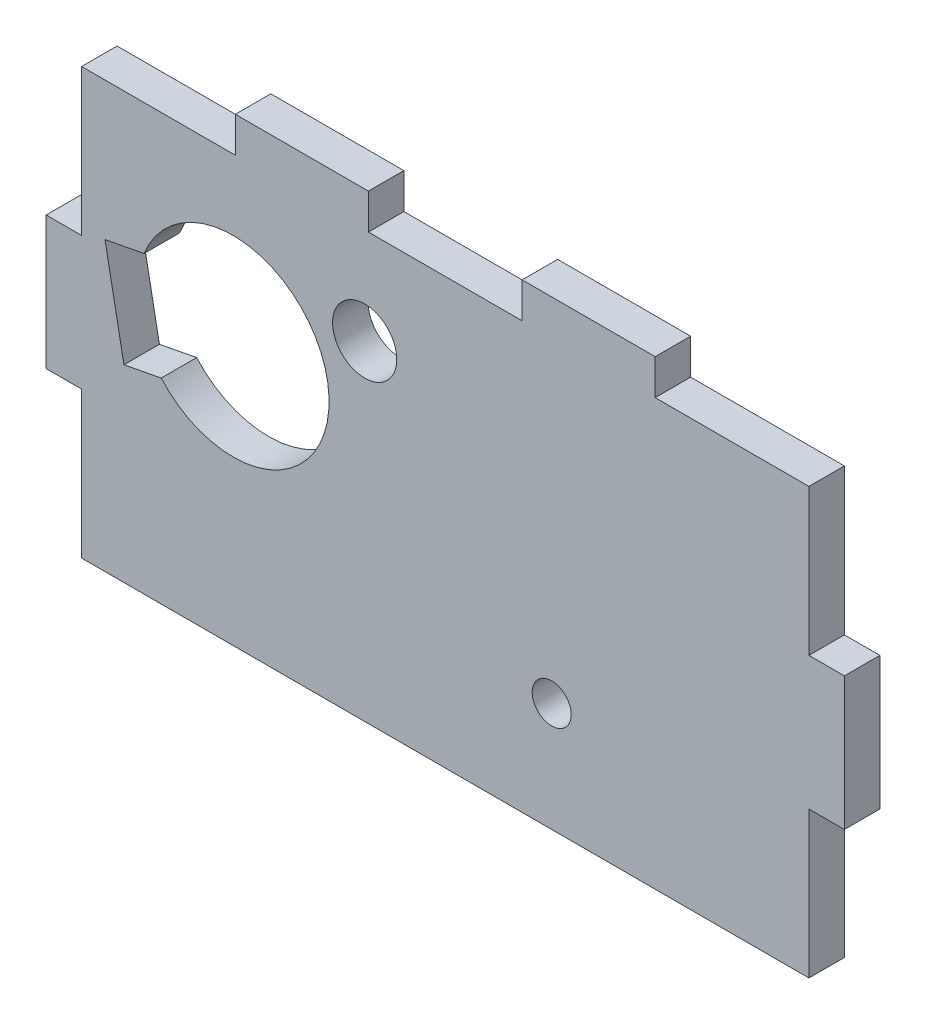
ISO-10303-21;
HEADER;
FILE_DESCRIPTION(('STEP AP214'),'2;1');
FILE_NAME('part.step','',(''),(''),'','','');
FILE_SCHEMA(('AUTOMOTIVE_DESIGN { 1 0 10303 214 1 1 1 1 }'));
ENDSEC;
DATA;
#1=APPLICATION_CONTEXT('core data for automotive mechanical design processes');
#2=APPLICATION_PROTOCOL_DEFINITION('international standard','automotive_design',2000,#1);
#3=PRODUCT_CONTEXT('',#1,'mechanical');
#4=PRODUCT('Part','Part','',(#3));
#5=PRODUCT_RELATED_PRODUCT_CATEGORY('part','',(#4));
#6=PRODUCT_DEFINITION_FORMATION('','',#4);
#7=PRODUCT_DEFINITION_CONTEXT('part definition',#1,'design');
#8=PRODUCT_DEFINITION('design','',#6,#7);
#9=PRODUCT_DEFINITION_SHAPE('','',#8);
#10=(LENGTH_UNIT() NAMED_UNIT(*) SI_UNIT(.MILLI.,.METRE.));
#11=(NAMED_UNIT(*) PLANE_ANGLE_UNIT() SI_UNIT($,.RADIAN.));
#12=(NAMED_UNIT(*) SI_UNIT($,.STERADIAN.) SOLID_ANGLE_UNIT());
#13=UNCERTAINTY_MEASURE_WITH_UNIT(LENGTH_MEASURE(1.E-05),#10,'distance_accuracy_value','');
#14=(GEOMETRIC_REPRESENTATION_CONTEXT(3) GLOBAL_UNCERTAINTY_ASSIGNED_CONTEXT((#13)) GLOBAL_UNIT_ASSIGNED_CONTEXT((#10,
#11,#12)) REPRESENTATION_CONTEXT('',''));
#15=CARTESIAN_POINT('',(0.,0.,0.));
#16=DIRECTION('',(0.,0.,1.));
#17=DIRECTION('',(1.,0.,0.));
#18=AXIS2_PLACEMENT_3D('',#15,#16,#17);
#19=CARTESIAN_POINT('',(0.,0.,0.));
#20=DIRECTION('',(0.,0.,-1.));
#21=DIRECTION('',(-1.,0.,0.));
#22=AXIS2_PLACEMENT_3D('',#19,#20,#21);
#23=PLANE('',#22);
#24=DIRECTION('',(0.982200113639865,0.187837527575926,0.));
#25=VECTOR('',#24,1.);
#26=CARTESIAN_POINT('',(-90.9897346608206,27.7567927002276,0.));
#27=LINE('',#26,#25);
#28=CARTESIAN_POINT('',(-90.9897346608206,27.7567927002276,0.));
#29=VERTEX_POINT('',#28);
#30=CARTESIAN_POINT('',(-85.4014088942553,28.8255130971236,0.));
#31=VERTEX_POINT('',#30);
#32=EDGE_CURVE('E697',#29,#31,#27,.T.);
#33=ORIENTED_EDGE('',*,*,#32,.F.);
#34=DIRECTION('',(-0.187837527575925,0.982200113639865,0.));
#35=VECTOR('',#34,1.);
#36=CARTESIAN_POINT('',(-88.2797650829773,13.5863952207226,0.));
#37=LINE('',#36,#35);
#38=CARTESIAN_POINT('',(-88.2797650829773,13.5863952207226,0.));
#39=VERTEX_POINT('',#38);
#40=EDGE_CURVE('E705',#39,#29,#37,.T.);
#41=ORIENTED_EDGE('',*,*,#40,.F.);
#42=DIRECTION('',(-0.982200113639865,-0.187837527575925,0.));
#43=VECTOR('',#42,1.);
#44=CARTESIAN_POINT('',(-82.9456318672805,14.6065034258459,0.));
#45=LINE('',#44,#43);
#46=CARTESIAN_POINT('',(-82.9456318672805,14.6065034258459,0.));
#47=VERTEX_POINT('',#46);
#48=EDGE_CURVE('E691',#47,#39,#45,.T.);
#49=ORIENTED_EDGE('',*,*,#48,.F.);
#50=CARTESIAN_POINT('',(-72.6491261926685,23.7063959995354,0.));
#51=DIRECTION('',(0.,0.,-1.));
#52=DIRECTION('',(-1.,0.,0.));
#53=AXIS2_PLACEMENT_3D('',#50,#51,#52);
#54=CIRCLE('',#53,13.7414);
#55=EDGE_CURVE('E11',#47,#31,#54,.F.);
#56=ORIENTED_EDGE('',*,*,#55,.T.);
#57=EDGE_LOOP('',(#33,#41,#49,#56));
#58=FACE_BOUND('',#57,.T.);
#59=DIRECTION('',(0.,1.,0.));
#60=VECTOR('',#59,1.);
#61=CARTESIAN_POINT('',(9.79813992244535,7.5392542189504,0.));
#62=LINE('',#61,#60);
#63=CARTESIAN_POINT('',(9.79813992244537,-13.4157457810496,0.));
#64=VERTEX_POINT('',#63);
#65=CARTESIAN_POINT('',(9.79813992244535,7.5392542189504,0.));
#66=VERTEX_POINT('',#65);
#67=EDGE_CURVE('E231',#64,#66,#62,.T.);
#68=ORIENTED_EDGE('',*,*,#67,.F.);
#69=DIRECTION('',(1.,0.,0.));
#70=VECTOR('',#69,1.);
#71=CARTESIAN_POINT('',(9.79813992244537,-13.4157457810496,0.));
#72=LINE('',#71,#70);
#73=CARTESIAN_POINT('',(-94.3418600775546,-13.4157457810496,0.));
#74=VERTEX_POINT('',#73);
#75=EDGE_CURVE('E229',#74,#64,#72,.T.);
#76=ORIENTED_EDGE('',*,*,#75,.F.);
#77=DIRECTION('',(0.,-1.,0.));
#78=VECTOR('',#77,1.);
#79=CARTESIAN_POINT('',(-94.3418600775546,-13.4157457810496,0.));
#80=LINE('',#79,#78);
#81=CARTESIAN_POINT('',(-94.3418600775546,7.53925421895039,0.));
#82=VERTEX_POINT('',#81);
#83=EDGE_CURVE('E227',#82,#74,#80,.T.);
#84=ORIENTED_EDGE('',*,*,#83,.F.);
#85=DIRECTION('',(1.,0.,0.));
#86=VECTOR('',#85,1.);
#87=CARTESIAN_POINT('',(-99.4218600775546,7.53925421895039,0.));
#88=LINE('',#87,#86);
#89=CARTESIAN_POINT('',(-99.4218600775546,7.53925421895039,0.));
#90=VERTEX_POINT('',#89);
#91=EDGE_CURVE('E225',#90,#82,#88,.T.);
#92=ORIENTED_EDGE('',*,*,#91,.F.);
#93=DIRECTION('',(0.,-1.,0.));
#94=VECTOR('',#93,1.);
#95=CARTESIAN_POINT('',(-99.4218600775546,26.5892542189504,0.));
#96=LINE('',#95,#94);
#97=CARTESIAN_POINT('',(-99.4218600775546,26.5892542189504,0.));
#98=VERTEX_POINT('',#97);
#99=EDGE_CURVE('E223',#98,#90,#96,.T.);
#100=ORIENTED_EDGE('',*,*,#99,.F.);
#101=DIRECTION('',(-1.,0.,0.));
#102=VECTOR('',#101,1.);
#103=CARTESIAN_POINT('',(-94.3418600775546,26.5892542189504,0.));
#104=LINE('',#103,#102);
#105=CARTESIAN_POINT('',(-94.3418600775546,26.5892542189504,0.));
#106=VERTEX_POINT('',#105);
#107=EDGE_CURVE('E220',#106,#98,#104,.T.);
#108=ORIENTED_EDGE('',*,*,#107,.F.);
#109=DIRECTION('',(0.,-1.,0.));
#110=VECTOR('',#109,1.);
#111=CARTESIAN_POINT('',(-94.3418600775546,47.5442542189504,0.));
#112=LINE('',#111,#110);
#113=CARTESIAN_POINT('',(-94.3418600775546,47.5442542189504,0.));
#114=VERTEX_POINT('',#113);
#115=EDGE_CURVE('E217',#114,#106,#112,.T.);
#116=ORIENTED_EDGE('',*,*,#115,.F.);
#117=DIRECTION('',(-1.,0.,0.));
#118=VECTOR('',#117,1.);
#119=CARTESIAN_POINT('',(-94.3418600775546,47.5442542189504,0.));
#120=LINE('',#119,#118);
#121=CARTESIAN_POINT('',(-72.3285267442213,47.5442542189504,0.));
#122=VERTEX_POINT('',#121);
#123=EDGE_CURVE('E128',#122,#114,#120,.T.);
#124=ORIENTED_EDGE('',*,*,#123,.F.);
#125=DIRECTION('',(0.,-1.,0.));
#126=VECTOR('',#125,1.);
#127=CARTESIAN_POINT('',(-72.3285267442213,47.5442542189504,0.));
#128=LINE('',#127,#126);
#129=CARTESIAN_POINT('',(-72.3285267442213,52.6242542189504,0.));
#130=VERTEX_POINT('',#129);
#131=EDGE_CURVE('E254',#130,#122,#128,.T.);
#132=ORIENTED_EDGE('',*,*,#131,.F.);
#133=DIRECTION('',(-1.,0.,0.));
#134=VECTOR('',#133,1.);
#135=CARTESIAN_POINT('',(-72.3285267442213,52.6242542189504,0.));
#136=LINE('',#135,#134);
#137=CARTESIAN_POINT('',(-53.2785267442213,52.6242542189504,0.));
#138=VERTEX_POINT('',#137);
#139=EDGE_CURVE('E205',#138,#130,#136,.T.);
#140=ORIENTED_EDGE('',*,*,#139,.F.);
#141=DIRECTION('',(0.,1.,0.));
#142=VECTOR('',#141,1.);
#143=CARTESIAN_POINT('',(-53.2785267442213,52.6242542189504,0.));
#144=LINE('',#143,#142);
#145=CARTESIAN_POINT('',(-53.2785267442213,47.5442542189504,0.));
#146=VERTEX_POINT('',#145);
#147=EDGE_CURVE('E251',#146,#138,#144,.T.);
#148=ORIENTED_EDGE('',*,*,#147,.F.);
#149=DIRECTION('',(-1.,0.,0.));
#150=VECTOR('',#149,1.);
#151=CARTESIAN_POINT('',(-53.2785267442213,47.5442542189504,0.));
#152=LINE('',#151,#150);
#153=CARTESIAN_POINT('',(-31.265193410888,47.5442542189504,0.));
#154=VERTEX_POINT('',#153);
#155=EDGE_CURVE('E249',#154,#146,#152,.T.);
#156=ORIENTED_EDGE('',*,*,#155,.F.);
#157=DIRECTION('',(0.,-1.,0.));
#158=VECTOR('',#157,1.);
#159=CARTESIAN_POINT('',(-31.265193410888,47.5442542189504,0.));
#160=LINE('',#159,#158);
#161=CARTESIAN_POINT('',(-31.265193410888,52.6242542189504,0.));
#162=VERTEX_POINT('',#161);
#163=EDGE_CURVE('E247',#162,#154,#160,.T.);
#164=ORIENTED_EDGE('',*,*,#163,.F.);
#165=DIRECTION('',(-1.,0.,0.));
#166=VECTOR('',#165,1.);
#167=CARTESIAN_POINT('',(-31.265193410888,52.6242542189504,0.));
#168=LINE('',#167,#166);
#169=CARTESIAN_POINT('',(-12.215193410888,52.6242542189504,0.));
#170=VERTEX_POINT('',#169);
#171=EDGE_CURVE('E245',#170,#162,#168,.T.);
#172=ORIENTED_EDGE('',*,*,#171,.F.);
#173=DIRECTION('',(0.,1.,0.));
#174=VECTOR('',#173,1.);
#175=CARTESIAN_POINT('',(-12.215193410888,52.6242542189504,0.));
#176=LINE('',#175,#174);
#177=CARTESIAN_POINT('',(-12.215193410888,47.5442542189504,0.));
#178=VERTEX_POINT('',#177);
#179=EDGE_CURVE('E243',#178,#170,#176,.T.);
#180=ORIENTED_EDGE('',*,*,#179,.F.);
#181=DIRECTION('',(-1.,0.,0.));
#182=VECTOR('',#181,1.);
#183=CARTESIAN_POINT('',(-12.215193410888,47.5442542189504,0.));
#184=LINE('',#183,#182);
#185=CARTESIAN_POINT('',(9.79813992244537,47.5442542189504,0.));
#186=VERTEX_POINT('',#185);
#187=EDGE_CURVE('E241',#186,#178,#184,.T.);
#188=ORIENTED_EDGE('',*,*,#187,.F.);
#189=DIRECTION('',(0.,1.,0.));
#190=VECTOR('',#189,1.);
#191=CARTESIAN_POINT('',(9.79813992244537,47.5442542189504,0.));
#192=LINE('',#191,#190);
#193=CARTESIAN_POINT('',(9.79813992244537,26.5892542189504,0.));
#194=VERTEX_POINT('',#193);
#195=EDGE_CURVE('E239',#194,#186,#192,.T.);
#196=ORIENTED_EDGE('',*,*,#195,.F.);
#197=DIRECTION('',(-1.,0.,0.));
#198=VECTOR('',#197,1.);
#199=CARTESIAN_POINT('',(9.79813992244537,26.5892542189504,0.));
#200=LINE('',#199,#198);
#201=CARTESIAN_POINT('',(14.8781399224454,26.5892542189504,0.));
#202=VERTEX_POINT('',#201);
#203=EDGE_CURVE('E237',#202,#194,#200,.T.);
#204=ORIENTED_EDGE('',*,*,#203,.F.);
#205=DIRECTION('',(0.,1.,0.));
#206=VECTOR('',#205,1.);
#207=CARTESIAN_POINT('',(14.8781399224454,26.5892542189504,0.));
#208=LINE('',#207,#206);
#209=CARTESIAN_POINT('',(14.8781399224454,7.53925421895041,0.));
#210=VERTEX_POINT('',#209);
#211=EDGE_CURVE('E235',#210,#202,#208,.T.);
#212=ORIENTED_EDGE('',*,*,#211,.F.);
#213=DIRECTION('',(1.,0.,0.));
#214=VECTOR('',#213,1.);
#215=CARTESIAN_POINT('',(14.8781399224454,7.53925421895041,0.));
#216=LINE('',#215,#214);
#217=EDGE_CURVE('E233',#66,#210,#216,.T.);
#218=ORIENTED_EDGE('',*,*,#217,.F.);
#219=EDGE_LOOP('',(#68,#76,#84,#92,#100,#108,#116,#124,#132,#140,#148,#156,#164,#172,#180,#188,
#196,#204,#212,#218));
#220=FACE_BOUND('',#219,.T.);
#221=CARTESIAN_POINT('',(-53.8118202960747,33.7712527304803,0.));
#222=DIRECTION('',(0.,0.,-1.));
#223=DIRECTION('',(-1.,0.,0.));
#224=AXIS2_PLACEMENT_3D('',#221,#222,#223);
#225=CIRCLE('',#224,4.59774384992705);
#226=CARTESIAN_POINT('',(-58.4095641460018,33.7712527304803,0.));
#227=VERTEX_POINT('',#226);
#228=EDGE_CURVE('E43',#227,#227,#225,.T.);
#229=ORIENTED_EDGE('',*,*,#228,.F.);
#230=EDGE_LOOP('',(#229));
#231=FACE_BOUND('',#230,.T.);
#232=CARTESIAN_POINT('',(-27.0318600775431,2.21795421895041,-2.14064876935538E-12));
#233=DIRECTION('',(0.,0.,1.));
#234=DIRECTION('',(0.463631123124594,0.886028318774421,0.));
#235=AXIS2_PLACEMENT_3D('',#232,#233,#234);
#236=CIRCLE('',#235,2.794);
#237=CARTESIAN_POINT('',(-25.736474719533,4.69351734160614,-2.04751672088125E-12));
#238=VERTEX_POINT('',#237);
#239=EDGE_CURVE('E221',#238,#238,#236,.T.);
#240=ORIENTED_EDGE('',*,*,#239,.T.);
#241=EDGE_LOOP('',(#240));
#242=FACE_BOUND('',#241,.T.);
#243=ADVANCED_FACE('F35',(#58,#220,#231,#242),#23,.T.);
#244=CARTESIAN_POINT('',(-94.3418600775546,47.5442542189504,5.08));
#245=DIRECTION('',(1.,0.,0.));
#246=DIRECTION('',(0.,0.,-1.));
#247=AXIS2_PLACEMENT_3D('',#244,#245,#246);
#248=PLANE('',#247);
#249=ORIENTED_EDGE('',*,*,#115,.T.);
#250=DIRECTION('',(0.,0.,-1.));
#251=VECTOR('',#250,1.);
#252=CARTESIAN_POINT('',(-94.3418600775546,26.5892542189504,5.08));
#253=LINE('',#252,#251);
#254=CARTESIAN_POINT('',(-94.3418600775546,26.5892542189504,5.08));
#255=VERTEX_POINT('',#254);
#256=EDGE_CURVE('E306',#255,#106,#253,.T.);
#257=ORIENTED_EDGE('',*,*,#256,.F.);
#258=DIRECTION('',(0.,-1.,0.));
#259=VECTOR('',#258,1.);
#260=CARTESIAN_POINT('',(-94.3418600775546,47.5442542189504,5.08));
#261=LINE('',#260,#259);
#262=CARTESIAN_POINT('',(-94.3418600775546,47.5442542189504,5.08));
#263=VERTEX_POINT('',#262);
#264=EDGE_CURVE('E257',#263,#255,#261,.T.);
#265=ORIENTED_EDGE('',*,*,#264,.F.);
#266=DIRECTION('',(0.,0.,-1.));
#267=VECTOR('',#266,1.);
#268=CARTESIAN_POINT('',(-94.3418600775546,47.5442542189504,5.08));
#269=LINE('',#268,#267);
#270=EDGE_CURVE('E213',#263,#114,#269,.T.);
#271=ORIENTED_EDGE('',*,*,#270,.T.);
#272=EDGE_LOOP('',(#249,#257,#265,#271));
#273=FACE_BOUND('',#272,.T.);
#274=ADVANCED_FACE('F37',(#273),#248,.F.);
#275=CARTESIAN_POINT('',(-94.3418600775546,26.5892542189504,5.08));
#276=DIRECTION('',(0.,-1.,0.));
#277=DIRECTION('',(0.,0.,-1.));
#278=AXIS2_PLACEMENT_3D('',#275,#276,#277);
#279=PLANE('',#278);
#280=ORIENTED_EDGE('',*,*,#107,.T.);
#281=DIRECTION('',(0.,0.,-1.));
#282=VECTOR('',#281,1.);
#283=CARTESIAN_POINT('',(-99.4218600775546,26.5892542189504,5.08));
#284=LINE('',#283,#282);
#285=CARTESIAN_POINT('',(-99.4218600775546,26.5892542189504,5.08));
#286=VERTEX_POINT('',#285);
#287=EDGE_CURVE('E303',#286,#98,#284,.T.);
#288=ORIENTED_EDGE('',*,*,#287,.F.);
#289=DIRECTION('',(-1.,0.,0.));
#290=VECTOR('',#289,1.);
#291=CARTESIAN_POINT('',(-94.3418600775546,26.5892542189504,5.08));
#292=LINE('',#291,#290);
#293=EDGE_CURVE('E137',#255,#286,#292,.T.);
#294=ORIENTED_EDGE('',*,*,#293,.F.);
#295=ORIENTED_EDGE('',*,*,#256,.T.);
#296=EDGE_LOOP('',(#280,#288,#294,#295));
#297=FACE_BOUND('',#296,.T.);
#298=ADVANCED_FACE('F376',(#297),#279,.F.);
#299=CARTESIAN_POINT('',(-99.4218600775546,26.5892542189504,5.08));
#300=DIRECTION('',(1.,0.,0.));
#301=DIRECTION('',(0.,1.,0.));
#302=AXIS2_PLACEMENT_3D('',#299,#300,#301);
#303=PLANE('',#302);
#304=ORIENTED_EDGE('',*,*,#99,.T.);
#305=DIRECTION('',(0.,0.,-1.));
#306=VECTOR('',#305,1.);
#307=CARTESIAN_POINT('',(-99.4218600775546,7.53925421895039,5.08));
#308=LINE('',#307,#306);
#309=CARTESIAN_POINT('',(-99.4218600775546,7.53925421895039,5.08));
#310=VERTEX_POINT('',#309);
#311=EDGE_CURVE('E300',#310,#90,#308,.T.);
#312=ORIENTED_EDGE('',*,*,#311,.F.);
#313=DIRECTION('',(0.,-1.,0.));
#314=VECTOR('',#313,1.);
#315=CARTESIAN_POINT('',(-99.4218600775546,26.5892542189504,5.08));
#316=LINE('',#315,#314);
#317=EDGE_CURVE('E330',#286,#310,#316,.T.);
#318=ORIENTED_EDGE('',*,*,#317,.F.);
#319=ORIENTED_EDGE('',*,*,#287,.T.);
#320=EDGE_LOOP('',(#304,#312,#318,#319));
#321=FACE_BOUND('',#320,.T.);
#322=ADVANCED_FACE('F379',(#321),#303,.F.);
#323=CARTESIAN_POINT('',(-99.4218600775546,7.53925421895039,5.08));
#324=DIRECTION('',(0.,1.,0.));
#325=DIRECTION('',(-1.,0.,0.));
#326=AXIS2_PLACEMENT_3D('',#323,#324,#325);
#327=PLANE('',#326);
#328=ORIENTED_EDGE('',*,*,#91,.T.);
#329=DIRECTION('',(0.,0.,-1.));
#330=VECTOR('',#329,1.);
#331=CARTESIAN_POINT('',(-94.3418600775546,7.53925421895039,5.08));
#332=LINE('',#331,#330);
#333=CARTESIAN_POINT('',(-94.3418600775546,7.53925421895039,5.08));
#334=VERTEX_POINT('',#333);
#335=EDGE_CURVE('E297',#334,#82,#332,.T.);
#336=ORIENTED_EDGE('',*,*,#335,.F.);
#337=DIRECTION('',(1.,0.,0.));
#338=VECTOR('',#337,1.);
#339=CARTESIAN_POINT('',(-99.4218600775546,7.53925421895039,5.08));
#340=LINE('',#339,#338);
#341=EDGE_CURVE('E332',#310,#334,#340,.T.);
#342=ORIENTED_EDGE('',*,*,#341,.F.);
#343=ORIENTED_EDGE('',*,*,#311,.T.);
#344=EDGE_LOOP('',(#328,#336,#342,#343));
#345=FACE_BOUND('',#344,.T.);
#346=ADVANCED_FACE('F384',(#345),#327,.F.);
#347=CARTESIAN_POINT('',(-94.3418600775546,-13.4157457810496,5.08));
#348=DIRECTION('',(1.,0.,0.));
#349=DIRECTION('',(0.,1.,0.));
#350=AXIS2_PLACEMENT_3D('',#347,#348,#349);
#351=PLANE('',#350);
#352=ORIENTED_EDGE('',*,*,#83,.T.);
#353=DIRECTION('',(0.,0.,-1.));
#354=VECTOR('',#353,1.);
#355=CARTESIAN_POINT('',(-94.3418600775546,-13.4157457810496,5.08));
#356=LINE('',#355,#354);
#357=CARTESIAN_POINT('',(-94.3418600775546,-13.4157457810496,5.08));
#358=VERTEX_POINT('',#357);
#359=EDGE_CURVE('E294',#358,#74,#356,.T.);
#360=ORIENTED_EDGE('',*,*,#359,.F.);
#361=DIRECTION('',(0.,-1.,0.));
#362=VECTOR('',#361,1.);
#363=CARTESIAN_POINT('',(-94.3418600775546,-13.4157457810496,5.08));
#364=LINE('',#363,#362);
#365=EDGE_CURVE('E334',#334,#358,#364,.T.);
#366=ORIENTED_EDGE('',*,*,#365,.F.);
#367=ORIENTED_EDGE('',*,*,#335,.T.);
#368=EDGE_LOOP('',(#352,#360,#366,#367));
#369=FACE_BOUND('',#368,.T.);
#370=ADVANCED_FACE('F390',(#369),#351,.F.);
#371=CARTESIAN_POINT('',(9.79813992244537,-13.4157457810496,5.08));
#372=DIRECTION('',(0.,1.,0.));
#373=DIRECTION('',(-1.,0.,0.));
#374=AXIS2_PLACEMENT_3D('',#371,#372,#373);
#375=PLANE('',#374);
#376=ORIENTED_EDGE('',*,*,#75,.T.);
#377=DIRECTION('',(0.,0.,-1.));
#378=VECTOR('',#377,1.);
#379=CARTESIAN_POINT('',(9.79813992244537,-13.4157457810496,5.08));
#380=LINE('',#379,#378);
#381=CARTESIAN_POINT('',(9.79813992244537,-13.4157457810496,5.08));
#382=VERTEX_POINT('',#381);
#383=EDGE_CURVE('E291',#382,#64,#380,.T.);
#384=ORIENTED_EDGE('',*,*,#383,.F.);
#385=DIRECTION('',(1.,0.,0.));
#386=VECTOR('',#385,1.);
#387=CARTESIAN_POINT('',(9.79813992244537,-13.4157457810496,5.08));
#388=LINE('',#387,#386);
#389=EDGE_CURVE('E336',#358,#382,#388,.T.);
#390=ORIENTED_EDGE('',*,*,#389,.F.);
#391=ORIENTED_EDGE('',*,*,#359,.T.);
#392=EDGE_LOOP('',(#376,#384,#390,#391));
#393=FACE_BOUND('',#392,.T.);
#394=ADVANCED_FACE('F394',(#393),#375,.F.);
#395=CARTESIAN_POINT('',(9.79813992244535,7.5392542189504,5.08));
#396=DIRECTION('',(-1.,0.,0.));
#397=DIRECTION('',(0.,-1.,0.));
#398=AXIS2_PLACEMENT_3D('',#395,#396,#397);
#399=PLANE('',#398);
#400=ORIENTED_EDGE('',*,*,#67,.T.);
#401=DIRECTION('',(0.,0.,-1.));
#402=VECTOR('',#401,1.);
#403=CARTESIAN_POINT('',(9.79813992244535,7.5392542189504,5.08));
#404=LINE('',#403,#402);
#405=CARTESIAN_POINT('',(9.79813992244535,7.5392542189504,5.08));
#406=VERTEX_POINT('',#405);
#407=EDGE_CURVE('E288',#406,#66,#404,.T.);
#408=ORIENTED_EDGE('',*,*,#407,.F.);
#409=DIRECTION('',(0.,1.,0.));
#410=VECTOR('',#409,1.);
#411=CARTESIAN_POINT('',(9.79813992244535,7.5392542189504,5.08));
#412=LINE('',#411,#410);
#413=EDGE_CURVE('E338',#382,#406,#412,.T.);
#414=ORIENTED_EDGE('',*,*,#413,.F.);
#415=ORIENTED_EDGE('',*,*,#383,.T.);
#416=EDGE_LOOP('',(#400,#408,#414,#415));
#417=FACE_BOUND('',#416,.T.);
#418=ADVANCED_FACE('F398',(#417),#399,.F.);
#419=CARTESIAN_POINT('',(14.8781399224454,7.53925421895041,5.08));
#420=DIRECTION('',(0.,1.,0.));
#421=DIRECTION('',(-1.,0.,0.));
#422=AXIS2_PLACEMENT_3D('',#419,#420,#421);
#423=PLANE('',#422);
#424=ORIENTED_EDGE('',*,*,#217,.T.);
#425=DIRECTION('',(0.,0.,-1.));
#426=VECTOR('',#425,1.);
#427=CARTESIAN_POINT('',(14.8781399224454,7.53925421895041,5.08));
#428=LINE('',#427,#426);
#429=CARTESIAN_POINT('',(14.8781399224454,7.53925421895041,5.08));
#430=VERTEX_POINT('',#429);
#431=EDGE_CURVE('E285',#430,#210,#428,.T.);
#432=ORIENTED_EDGE('',*,*,#431,.F.);
#433=DIRECTION('',(1.,0.,0.));
#434=VECTOR('',#433,1.);
#435=CARTESIAN_POINT('',(14.8781399224454,7.53925421895041,5.08));
#436=LINE('',#435,#434);
#437=EDGE_CURVE('E340',#406,#430,#436,.T.);
#438=ORIENTED_EDGE('',*,*,#437,.F.);
#439=ORIENTED_EDGE('',*,*,#407,.T.);
#440=EDGE_LOOP('',(#424,#432,#438,#439));
#441=FACE_BOUND('',#440,.T.);
#442=ADVANCED_FACE('F404',(#441),#423,.F.);
#443=CARTESIAN_POINT('',(14.8781399224454,26.5892542189504,5.08));
#444=DIRECTION('',(-1.,0.,0.));
#445=DIRECTION('',(0.,0.,1.));
#446=AXIS2_PLACEMENT_3D('',#443,#444,#445);
#447=PLANE('',#446);
#448=ORIENTED_EDGE('',*,*,#211,.T.);
#449=DIRECTION('',(0.,0.,-1.));
#450=VECTOR('',#449,1.);
#451=CARTESIAN_POINT('',(14.8781399224454,26.5892542189504,5.08));
#452=LINE('',#451,#450);
#453=CARTESIAN_POINT('',(14.8781399224454,26.5892542189504,5.08));
#454=VERTEX_POINT('',#453);
#455=EDGE_CURVE('E282',#454,#202,#452,.T.);
#456=ORIENTED_EDGE('',*,*,#455,.F.);
#457=DIRECTION('',(0.,1.,0.));
#458=VECTOR('',#457,1.);
#459=CARTESIAN_POINT('',(14.8781399224454,26.5892542189504,5.08));
#460=LINE('',#459,#458);
#461=EDGE_CURVE('E342',#430,#454,#460,.T.);
#462=ORIENTED_EDGE('',*,*,#461,.F.);
#463=ORIENTED_EDGE('',*,*,#431,.T.);
#464=EDGE_LOOP('',(#448,#456,#462,#463));
#465=FACE_BOUND('',#464,.T.);
#466=ADVANCED_FACE('F408',(#465),#447,.F.);
#467=CARTESIAN_POINT('',(9.79813992244537,26.5892542189504,5.08));
#468=DIRECTION('',(0.,-1.,0.));
#469=DIRECTION('',(0.,0.,-1.));
#470=AXIS2_PLACEMENT_3D('',#467,#468,#469);
#471=PLANE('',#470);
#472=ORIENTED_EDGE('',*,*,#203,.T.);
#473=DIRECTION('',(0.,0.,-1.));
#474=VECTOR('',#473,1.);
#475=CARTESIAN_POINT('',(9.79813992244537,26.5892542189504,5.08));
#476=LINE('',#475,#474);
#477=CARTESIAN_POINT('',(9.79813992244537,26.5892542189504,5.08));
#478=VERTEX_POINT('',#477);
#479=EDGE_CURVE('E279',#478,#194,#476,.T.);
#480=ORIENTED_EDGE('',*,*,#479,.F.);
#481=DIRECTION('',(-1.,0.,0.));
#482=VECTOR('',#481,1.);
#483=CARTESIAN_POINT('',(9.79813992244537,26.5892542189504,5.08));
#484=LINE('',#483,#482);
#485=EDGE_CURVE('E344',#454,#478,#484,.T.);
#486=ORIENTED_EDGE('',*,*,#485,.F.);
#487=ORIENTED_EDGE('',*,*,#455,.T.);
#488=EDGE_LOOP('',(#472,#480,#486,#487));
#489=FACE_BOUND('',#488,.T.);
#490=ADVANCED_FACE('F413',(#489),#471,.F.);
#491=CARTESIAN_POINT('',(9.79813992244537,47.5442542189504,5.08));
#492=DIRECTION('',(-1.,0.,0.));
#493=DIRECTION('',(0.,0.,1.));
#494=AXIS2_PLACEMENT_3D('',#491,#492,#493);
#495=PLANE('',#494);
#496=ORIENTED_EDGE('',*,*,#195,.T.);
#497=DIRECTION('',(0.,0.,-1.));
#498=VECTOR('',#497,1.);
#499=CARTESIAN_POINT('',(9.79813992244537,47.5442542189504,5.08));
#500=LINE('',#499,#498);
#501=CARTESIAN_POINT('',(9.79813992244537,47.5442542189504,5.08));
#502=VERTEX_POINT('',#501);
#503=EDGE_CURVE('E276',#502,#186,#500,.T.);
#504=ORIENTED_EDGE('',*,*,#503,.F.);
#505=DIRECTION('',(0.,1.,0.));
#506=VECTOR('',#505,1.);
#507=CARTESIAN_POINT('',(9.79813992244537,47.5442542189504,5.08));
#508=LINE('',#507,#506);
#509=EDGE_CURVE('E346',#478,#502,#508,.T.);
#510=ORIENTED_EDGE('',*,*,#509,.F.);
#511=ORIENTED_EDGE('',*,*,#479,.T.);
#512=EDGE_LOOP('',(#496,#504,#510,#511));
#513=FACE_BOUND('',#512,.T.);
#514=ADVANCED_FACE('F419',(#513),#495,.F.);
#515=CARTESIAN_POINT('',(-12.215193410888,47.5442542189504,5.08));
#516=DIRECTION('',(0.,-1.,0.));
#517=DIRECTION('',(0.,0.,-1.));
#518=AXIS2_PLACEMENT_3D('',#515,#516,#517);
#519=PLANE('',#518);
#520=ORIENTED_EDGE('',*,*,#187,.T.);
#521=DIRECTION('',(0.,0.,-1.));
#522=VECTOR('',#521,1.);
#523=CARTESIAN_POINT('',(-12.215193410888,47.5442542189504,5.08));
#524=LINE('',#523,#522);
#525=CARTESIAN_POINT('',(-12.215193410888,47.5442542189504,5.08));
#526=VERTEX_POINT('',#525);
#527=EDGE_CURVE('E273',#526,#178,#524,.T.);
#528=ORIENTED_EDGE('',*,*,#527,.F.);
#529=DIRECTION('',(-1.,0.,0.));
#530=VECTOR('',#529,1.);
#531=CARTESIAN_POINT('',(-12.215193410888,47.5442542189504,5.08));
#532=LINE('',#531,#530);
#533=EDGE_CURVE('E348',#502,#526,#532,.T.);
#534=ORIENTED_EDGE('',*,*,#533,.F.);
#535=ORIENTED_EDGE('',*,*,#503,.T.);
#536=EDGE_LOOP('',(#520,#528,#534,#535));
#537=FACE_BOUND('',#536,.T.);
#538=ADVANCED_FACE('F423',(#537),#519,.F.);
#539=CARTESIAN_POINT('',(-12.215193410888,52.6242542189504,5.08));
#540=DIRECTION('',(-1.,0.,0.));
#541=DIRECTION('',(0.,0.,1.));
#542=AXIS2_PLACEMENT_3D('',#539,#540,#541);
#543=PLANE('',#542);
#544=ORIENTED_EDGE('',*,*,#179,.T.);
#545=DIRECTION('',(0.,0.,-1.));
#546=VECTOR('',#545,1.);
#547=CARTESIAN_POINT('',(-12.215193410888,52.6242542189504,5.08));
#548=LINE('',#547,#546);
#549=CARTESIAN_POINT('',(-12.215193410888,52.6242542189504,5.08));
#550=VERTEX_POINT('',#549);
#551=EDGE_CURVE('E270',#550,#170,#548,.T.);
#552=ORIENTED_EDGE('',*,*,#551,.F.);
#553=DIRECTION('',(0.,1.,0.));
#554=VECTOR('',#553,1.);
#555=CARTESIAN_POINT('',(-12.215193410888,52.6242542189504,5.08));
#556=LINE('',#555,#554);
#557=EDGE_CURVE('E350',#526,#550,#556,.T.);
#558=ORIENTED_EDGE('',*,*,#557,.F.);
#559=ORIENTED_EDGE('',*,*,#527,.T.);
#560=EDGE_LOOP('',(#544,#552,#558,#559));
#561=FACE_BOUND('',#560,.T.);
#562=ADVANCED_FACE('F428',(#561),#543,.F.);
#563=CARTESIAN_POINT('',(-31.265193410888,52.6242542189504,5.08));
#564=DIRECTION('',(0.,-1.,0.));
#565=DIRECTION('',(0.,0.,-1.));
#566=AXIS2_PLACEMENT_3D('',#563,#564,#565);
#567=PLANE('',#566);
#568=ORIENTED_EDGE('',*,*,#171,.T.);
#569=DIRECTION('',(0.,0.,-1.));
#570=VECTOR('',#569,1.);
#571=CARTESIAN_POINT('',(-31.265193410888,52.6242542189504,5.08));
#572=LINE('',#571,#570);
#573=CARTESIAN_POINT('',(-31.265193410888,52.6242542189504,5.08));
#574=VERTEX_POINT('',#573);
#575=EDGE_CURVE('E267',#574,#162,#572,.T.);
#576=ORIENTED_EDGE('',*,*,#575,.F.);
#577=DIRECTION('',(-1.,0.,0.));
#578=VECTOR('',#577,1.);
#579=CARTESIAN_POINT('',(-31.265193410888,52.6242542189504,5.08));
#580=LINE('',#579,#578);
#581=EDGE_CURVE('E352',#550,#574,#580,.T.);
#582=ORIENTED_EDGE('',*,*,#581,.F.);
#583=ORIENTED_EDGE('',*,*,#551,.T.);
#584=EDGE_LOOP('',(#568,#576,#582,#583));
#585=FACE_BOUND('',#584,.T.);
#586=ADVANCED_FACE('F432',(#585),#567,.F.);
#587=CARTESIAN_POINT('',(-31.265193410888,47.5442542189504,5.08));
#588=DIRECTION('',(1.,0.,0.));
#589=DIRECTION('',(0.,0.,-1.));
#590=AXIS2_PLACEMENT_3D('',#587,#588,#589);
#591=PLANE('',#590);
#592=ORIENTED_EDGE('',*,*,#163,.T.);
#593=DIRECTION('',(0.,0.,-1.));
#594=VECTOR('',#593,1.);
#595=CARTESIAN_POINT('',(-31.265193410888,47.5442542189504,5.08));
#596=LINE('',#595,#594);
#597=CARTESIAN_POINT('',(-31.265193410888,47.5442542189504,5.08));
#598=VERTEX_POINT('',#597);
#599=EDGE_CURVE('E264',#598,#154,#596,.T.);
#600=ORIENTED_EDGE('',*,*,#599,.F.);
#601=DIRECTION('',(0.,-1.,0.));
#602=VECTOR('',#601,1.);
#603=CARTESIAN_POINT('',(-31.265193410888,47.5442542189504,5.08));
#604=LINE('',#603,#602);
#605=EDGE_CURVE('E354',#574,#598,#604,.T.);
#606=ORIENTED_EDGE('',*,*,#605,.F.);
#607=ORIENTED_EDGE('',*,*,#575,.T.);
#608=EDGE_LOOP('',(#592,#600,#606,#607));
#609=FACE_BOUND('',#608,.T.);
#610=ADVANCED_FACE('F436',(#609),#591,.F.);
#611=CARTESIAN_POINT('',(-53.2785267442213,47.5442542189504,5.08));
#612=DIRECTION('',(0.,-1.,0.));
#613=DIRECTION('',(0.,0.,-1.));
#614=AXIS2_PLACEMENT_3D('',#611,#612,#613);
#615=PLANE('',#614);
#616=ORIENTED_EDGE('',*,*,#155,.T.);
#617=DIRECTION('',(0.,0.,-1.));
#618=VECTOR('',#617,1.);
#619=CARTESIAN_POINT('',(-53.2785267442213,47.5442542189504,5.08));
#620=LINE('',#619,#618);
#621=CARTESIAN_POINT('',(-53.2785267442213,47.5442542189504,5.08));
#622=VERTEX_POINT('',#621);
#623=EDGE_CURVE('E261',#622,#146,#620,.T.);
#624=ORIENTED_EDGE('',*,*,#623,.F.);
#625=DIRECTION('',(-1.,0.,0.));
#626=VECTOR('',#625,1.);
#627=CARTESIAN_POINT('',(-53.2785267442213,47.5442542189504,5.08));
#628=LINE('',#627,#626);
#629=EDGE_CURVE('E356',#598,#622,#628,.T.);
#630=ORIENTED_EDGE('',*,*,#629,.F.);
#631=ORIENTED_EDGE('',*,*,#599,.T.);
#632=EDGE_LOOP('',(#616,#624,#630,#631));
#633=FACE_BOUND('',#632,.T.);
#634=ADVANCED_FACE('F362',(#633),#615,.F.);
#635=CARTESIAN_POINT('',(-53.2785267442213,52.6242542189504,5.08));
#636=DIRECTION('',(-1.,0.,0.));
#637=DIRECTION('',(0.,0.,1.));
#638=AXIS2_PLACEMENT_3D('',#635,#636,#637);
#639=PLANE('',#638);
#640=ORIENTED_EDGE('',*,*,#147,.T.);
#641=DIRECTION('',(0.,0.,-1.));
#642=VECTOR('',#641,1.);
#643=CARTESIAN_POINT('',(-53.2785267442213,52.6242542189504,5.08));
#644=LINE('',#643,#642);
#645=CARTESIAN_POINT('',(-53.2785267442213,52.6242542189504,5.08));
#646=VERTEX_POINT('',#645);
#647=EDGE_CURVE('E208',#646,#138,#644,.T.);
#648=ORIENTED_EDGE('',*,*,#647,.F.);
#649=DIRECTION('',(0.,1.,0.));
#650=VECTOR('',#649,1.);
#651=CARTESIAN_POINT('',(-53.2785267442213,52.6242542189504,5.08));
#652=LINE('',#651,#650);
#653=EDGE_CURVE('E196',#622,#646,#652,.T.);
#654=ORIENTED_EDGE('',*,*,#653,.F.);
#655=ORIENTED_EDGE('',*,*,#623,.T.);
#656=EDGE_LOOP('',(#640,#648,#654,#655));
#657=FACE_BOUND('',#656,.T.);
#658=ADVANCED_FACE('F366',(#657),#639,.F.);
#659=CARTESIAN_POINT('',(-72.3285267442213,52.6242542189504,5.08));
#660=DIRECTION('',(0.,-1.,0.));
#661=DIRECTION('',(0.,0.,-1.));
#662=AXIS2_PLACEMENT_3D('',#659,#660,#661);
#663=PLANE('',#662);
#664=ORIENTED_EDGE('',*,*,#139,.T.);
#665=DIRECTION('',(0.,0.,-1.));
#666=VECTOR('',#665,1.);
#667=CARTESIAN_POINT('',(-72.3285267442213,52.6242542189504,5.08));
#668=LINE('',#667,#666);
#669=CARTESIAN_POINT('',(-72.3285267442213,52.6242542189504,5.08));
#670=VERTEX_POINT('',#669);
#671=EDGE_CURVE('E202',#670,#130,#668,.T.);
#672=ORIENTED_EDGE('',*,*,#671,.F.);
#673=DIRECTION('',(-1.,0.,0.));
#674=VECTOR('',#673,1.);
#675=CARTESIAN_POINT('',(-72.3285267442213,52.6242542189504,5.08));
#676=LINE('',#675,#674);
#677=EDGE_CURVE('E189',#646,#670,#676,.T.);
#678=ORIENTED_EDGE('',*,*,#677,.F.);
#679=ORIENTED_EDGE('',*,*,#647,.T.);
#680=EDGE_LOOP('',(#664,#672,#678,#679));
#681=FACE_BOUND('',#680,.T.);
#682=ADVANCED_FACE('F203',(#681),#663,.F.);
#683=CARTESIAN_POINT('',(-72.3285267442213,47.5442542189504,5.08));
#684=DIRECTION('',(1.,0.,0.));
#685=DIRECTION('',(0.,0.,-1.));
#686=AXIS2_PLACEMENT_3D('',#683,#684,#685);
#687=PLANE('',#686);
#688=ORIENTED_EDGE('',*,*,#131,.T.);
#689=DIRECTION('',(0.,0.,-1.));
#690=VECTOR('',#689,1.);
#691=CARTESIAN_POINT('',(-72.3285267442213,47.5442542189504,5.08));
#692=LINE('',#691,#690);
#693=CARTESIAN_POINT('',(-72.3285267442213,47.5442542189504,5.08));
#694=VERTEX_POINT('',#693);
#695=EDGE_CURVE('E209',#694,#122,#692,.T.);
#696=ORIENTED_EDGE('',*,*,#695,.F.);
#697=DIRECTION('',(0.,-1.,0.));
#698=VECTOR('',#697,1.);
#699=CARTESIAN_POINT('',(-72.3285267442213,47.5442542189504,5.08));
#700=LINE('',#699,#698);
#701=EDGE_CURVE('E193',#670,#694,#700,.T.);
#702=ORIENTED_EDGE('',*,*,#701,.F.);
#703=ORIENTED_EDGE('',*,*,#671,.T.);
#704=EDGE_LOOP('',(#688,#696,#702,#703));
#705=FACE_BOUND('',#704,.T.);
#706=ADVANCED_FACE('F211',(#705),#687,.F.);
#707=CARTESIAN_POINT('',(-94.3418600775546,47.5442542189504,5.08));
#708=DIRECTION('',(0.,-1.,0.));
#709=DIRECTION('',(0.,0.,-1.));
#710=AXIS2_PLACEMENT_3D('',#707,#708,#709);
#711=PLANE('',#710);
#712=ORIENTED_EDGE('',*,*,#123,.T.);
#713=ORIENTED_EDGE('',*,*,#270,.F.);
#714=DIRECTION('',(-1.,0.,0.));
#715=VECTOR('',#714,1.);
#716=CARTESIAN_POINT('',(-94.3418600775546,47.5442542189504,5.08));
#717=LINE('',#716,#715);
#718=EDGE_CURVE('E59',#694,#263,#717,.T.);
#719=ORIENTED_EDGE('',*,*,#718,.F.);
#720=ORIENTED_EDGE('',*,*,#695,.T.);
#721=EDGE_LOOP('',(#712,#713,#719,#720));
#722=FACE_BOUND('',#721,.T.);
#723=ADVANCED_FACE('F370',(#722),#711,.F.);
#724=CARTESIAN_POINT('',(0.,0.,5.08));
#725=DIRECTION('',(0.,0.,-1.));
#726=DIRECTION('',(-1.,0.,0.));
#727=AXIS2_PLACEMENT_3D('',#724,#725,#726);
#728=PLANE('',#727);
#729=CARTESIAN_POINT('',(-27.0318600775432,2.21795421895041,5.08));
#730=DIRECTION('',(0.,0.,-1.));
#731=DIRECTION('',(-1.,0.,0.));
#732=AXIS2_PLACEMENT_3D('',#729,#730,#731);
#733=CIRCLE('',#732,2.794);
#734=CARTESIAN_POINT('',(-29.8258600775432,2.21795421895041,5.08));
#735=VERTEX_POINT('',#734);
#736=EDGE_CURVE('E687',#735,#735,#733,.F.);
#737=ORIENTED_EDGE('',*,*,#736,.F.);
#738=EDGE_LOOP('',(#737));
#739=FACE_BOUND('',#738,.T.);
#740=CARTESIAN_POINT('',(-53.811820296075,33.7712527304803,5.08));
#741=DIRECTION('',(0.,0.,-1.));
#742=DIRECTION('',(-1.,0.,0.));
#743=AXIS2_PLACEMENT_3D('',#740,#741,#742);
#744=CIRCLE('',#743,4.59774384992706);
#745=CARTESIAN_POINT('',(-58.4095641460021,33.7712527304803,5.08));
#746=VERTEX_POINT('',#745);
#747=EDGE_CURVE('E688',#746,#746,#744,.F.);
#748=ORIENTED_EDGE('',*,*,#747,.F.);
#749=EDGE_LOOP('',(#748));
#750=FACE_BOUND('',#749,.T.);
#751=DIRECTION('',(-0.982200113639865,-0.187837527575926,0.));
#752=VECTOR('',#751,1.);
#753=CARTESIAN_POINT('',(-90.9897346608206,27.7567927002276,5.08));
#754=LINE('',#753,#752);
#755=CARTESIAN_POINT('',(-85.4014088942553,28.8255130971236,5.08));
#756=VERTEX_POINT('',#755);
#757=CARTESIAN_POINT('',(-90.9897346608206,27.7567927002276,5.08));
#758=VERTEX_POINT('',#757);
#759=EDGE_CURVE('E696',#756,#758,#754,.T.);
#760=ORIENTED_EDGE('',*,*,#759,.F.);
#761=CARTESIAN_POINT('',(-72.6491261926688,23.7063959995354,5.08));
#762=DIRECTION('',(0.,0.,-1.));
#763=DIRECTION('',(-1.,0.,0.));
#764=AXIS2_PLACEMENT_3D('',#761,#762,#763);
#765=CIRCLE('',#764,13.7414);
#766=CARTESIAN_POINT('',(-82.9456318672805,14.6065034258459,5.08));
#767=VERTEX_POINT('',#766);
#768=EDGE_CURVE('E700',#767,#756,#765,.F.);
#769=ORIENTED_EDGE('',*,*,#768,.F.);
#770=DIRECTION('',(0.982200113639865,0.187837527575925,0.));
#771=VECTOR('',#770,1.);
#772=CARTESIAN_POINT('',(-82.9456318672805,14.6065034258459,5.08));
#773=LINE('',#772,#771);
#774=CARTESIAN_POINT('',(-88.2797650829773,13.5863952207226,5.08));
#775=VERTEX_POINT('',#774);
#776=EDGE_CURVE('E703',#775,#767,#773,.T.);
#777=ORIENTED_EDGE('',*,*,#776,.F.);
#778=DIRECTION('',(0.187837527575925,-0.982200113639865,0.));
#779=VECTOR('',#778,1.);
#780=CARTESIAN_POINT('',(-88.2797650829773,13.5863952207226,5.08));
#781=LINE('',#780,#779);
#782=EDGE_CURVE('E694',#758,#775,#781,.T.);
#783=ORIENTED_EDGE('',*,*,#782,.F.);
#784=EDGE_LOOP('',(#760,#769,#777,#783));
#785=FACE_BOUND('',#784,.T.);
#786=ORIENTED_EDGE('',*,*,#264,.T.);
#787=ORIENTED_EDGE('',*,*,#293,.T.);
#788=ORIENTED_EDGE('',*,*,#317,.T.);
#789=ORIENTED_EDGE('',*,*,#341,.T.);
#790=ORIENTED_EDGE('',*,*,#365,.T.);
#791=ORIENTED_EDGE('',*,*,#389,.T.);
#792=ORIENTED_EDGE('',*,*,#413,.T.);
#793=ORIENTED_EDGE('',*,*,#437,.T.);
#794=ORIENTED_EDGE('',*,*,#461,.T.);
#795=ORIENTED_EDGE('',*,*,#485,.T.);
#796=ORIENTED_EDGE('',*,*,#509,.T.);
#797=ORIENTED_EDGE('',*,*,#533,.T.);
#798=ORIENTED_EDGE('',*,*,#557,.T.);
#799=ORIENTED_EDGE('',*,*,#581,.T.);
#800=ORIENTED_EDGE('',*,*,#605,.T.);
#801=ORIENTED_EDGE('',*,*,#629,.T.);
#802=ORIENTED_EDGE('',*,*,#653,.T.);
#803=ORIENTED_EDGE('',*,*,#677,.T.);
#804=ORIENTED_EDGE('',*,*,#701,.T.);
#805=ORIENTED_EDGE('',*,*,#718,.T.);
#806=EDGE_LOOP('',(#786,#787,#788,#789,#790,#791,#792,#793,#794,#795,#796,#797,#798,#799,#800,
#801,#802,#803,#804,#805));
#807=FACE_BOUND('',#806,.T.);
#808=ADVANCED_FACE('F191',(#739,#750,#785,#807),#728,.F.);
#809=CARTESIAN_POINT('',(-53.8118202960732,33.7712527304803,-21.8694000000041));
#810=DIRECTION('',(0.,0.,1.));
#811=DIRECTION('',(0.463631123124594,0.886028318774421,0.));
#812=AXIS2_PLACEMENT_3D('',#809,#810,#811);
#813=CYLINDRICAL_SURFACE('',#812,4.59774384992705);
#814=ORIENTED_EDGE('',*,*,#228,.T.);
#815=EDGE_LOOP('',(#814));
#816=FACE_BOUND('',#815,.T.);
#817=ORIENTED_EDGE('',*,*,#747,.T.);
#818=EDGE_LOOP('',(#817));
#819=FACE_BOUND('',#818,.T.);
#820=ADVANCED_FACE('F310',(#816,#819),#813,.F.);
#821=CARTESIAN_POINT('',(-90.9897346608206,27.7567927002276,3.25119999999326));
#822=DIRECTION('',(-0.982200113639865,-0.187837527575925,0.));
#823=DIRECTION('',(0.187837527575925,-0.982200113639865,0.));
#824=AXIS2_PLACEMENT_3D('',#821,#822,#823);
#825=PLANE('',#824);
#826=DIRECTION('',(0.,0.,1.));
#827=VECTOR('',#826,1.);
#828=CARTESIAN_POINT('',(-90.9897346608206,27.7567927002276,3.25119999999326));
#829=LINE('',#828,#827);
#830=EDGE_CURVE('E711',#29,#758,#829,.T.);
#831=ORIENTED_EDGE('',*,*,#830,.T.);
#832=ORIENTED_EDGE('',*,*,#782,.T.);
#833=DIRECTION('',(0.,0.,1.));
#834=VECTOR('',#833,1.);
#835=CARTESIAN_POINT('',(-88.2797650829772,13.5863952207226,3.25119999999345));
#836=LINE('',#835,#834);
#837=EDGE_CURVE('E50',#39,#775,#836,.T.);
#838=ORIENTED_EDGE('',*,*,#837,.F.);
#839=ORIENTED_EDGE('',*,*,#40,.T.);
#840=EDGE_LOOP('',(#831,#832,#838,#839));
#841=FACE_BOUND('',#840,.T.);
#842=ADVANCED_FACE('F503',(#841),#825,.F.);
#843=CARTESIAN_POINT('',(-85.4014088942552,28.8255130971236,3.25119999999366));
#844=DIRECTION('',(-0.187837527575925,0.982200113639865,0.));
#845=DIRECTION('',(-0.982200113639865,-0.187837527575926,0.));
#846=AXIS2_PLACEMENT_3D('',#843,#844,#845);
#847=PLANE('',#846);
#848=DIRECTION('',(0.,0.,1.));
#849=VECTOR('',#848,1.);
#850=CARTESIAN_POINT('',(-85.4014088942552,28.8255130971236,3.25119999999366));
#851=LINE('',#850,#849);
#852=EDGE_CURVE('E326',#31,#756,#851,.T.);
#853=ORIENTED_EDGE('',*,*,#852,.T.);
#854=ORIENTED_EDGE('',*,*,#759,.T.);
#855=ORIENTED_EDGE('',*,*,#830,.F.);
#856=ORIENTED_EDGE('',*,*,#32,.T.);
#857=EDGE_LOOP('',(#853,#854,#855,#856));
#858=FACE_BOUND('',#857,.T.);
#859=ADVANCED_FACE('F513',(#858),#847,.F.);
#860=CARTESIAN_POINT('',(-88.2797650829772,13.5863952207226,3.25119999999345));
#861=DIRECTION('',(0.187837527575924,-0.982200113639865,0.));
#862=DIRECTION('',(0.982200113639865,0.187837527575924,0.));
#863=AXIS2_PLACEMENT_3D('',#860,#861,#862);
#864=PLANE('',#863);
#865=ORIENTED_EDGE('',*,*,#837,.T.);
#866=ORIENTED_EDGE('',*,*,#776,.T.);
#867=DIRECTION('',(0.,0.,1.));
#868=VECTOR('',#867,1.);
#869=CARTESIAN_POINT('',(-82.9456318672805,14.6065034258459,3.25119999999384));
#870=LINE('',#869,#868);
#871=EDGE_CURVE('E320',#47,#767,#870,.T.);
#872=ORIENTED_EDGE('',*,*,#871,.F.);
#873=ORIENTED_EDGE('',*,*,#48,.T.);
#874=EDGE_LOOP('',(#865,#866,#872,#873));
#875=FACE_BOUND('',#874,.T.);
#876=ADVANCED_FACE('F524',(#875),#864,.F.);
#877=CARTESIAN_POINT('',(-72.6491261926688,23.7063959995354,4.36879999999457));
#878=DIRECTION('',(0.,0.,-1.));
#879=DIRECTION('',(-0.463631123124594,-0.886028318774421,0.));
#880=AXIS2_PLACEMENT_3D('',#877,#878,#879);
#881=CYLINDRICAL_SURFACE('',#880,13.7414);
#882=ORIENTED_EDGE('',*,*,#852,.F.);
#883=ORIENTED_EDGE('',*,*,#55,.F.);
#884=ORIENTED_EDGE('',*,*,#871,.T.);
#885=ORIENTED_EDGE('',*,*,#768,.T.);
#886=EDGE_LOOP('',(#882,#883,#884,#885));
#887=FACE_BOUND('',#886,.T.);
#888=ADVANCED_FACE('F535',(#887),#881,.F.);
#889=CARTESIAN_POINT('',(-27.0318600775432,2.21795421895041,0.711199999997858));
#890=DIRECTION('',(0.,0.,-1.));
#891=DIRECTION('',(-0.463631123124594,-0.886028318774421,0.));
#892=AXIS2_PLACEMENT_3D('',#889,#890,#891);
#893=CYLINDRICAL_SURFACE('',#892,2.794);
#894=ORIENTED_EDGE('',*,*,#239,.F.);
#895=EDGE_LOOP('',(#894));
#896=FACE_BOUND('',#895,.T.);
#897=ORIENTED_EDGE('',*,*,#736,.T.);
#898=EDGE_LOOP('',(#897));
#899=FACE_BOUND('',#898,.T.);
#900=ADVANCED_FACE('F545',(#896,#899),#893,.F.);
#901=CLOSED_SHELL('',(#243,#274,#298,#322,#346,#370,#394,#418,#442,#466,#490,#514,#538,#562,
#586,#610,#634,#658,#682,#706,#723,#808,#820,#842,#859,#876,#888,#900));
#902=MANIFOLD_SOLID_BREP('B2',#901);
#903=ADVANCED_BREP_SHAPE_REPRESENTATION('',(#18,#902),#14);
#904=SHAPE_DEFINITION_REPRESENTATION(#9,#903);
ENDSEC;
END-ISO-10303-21;
